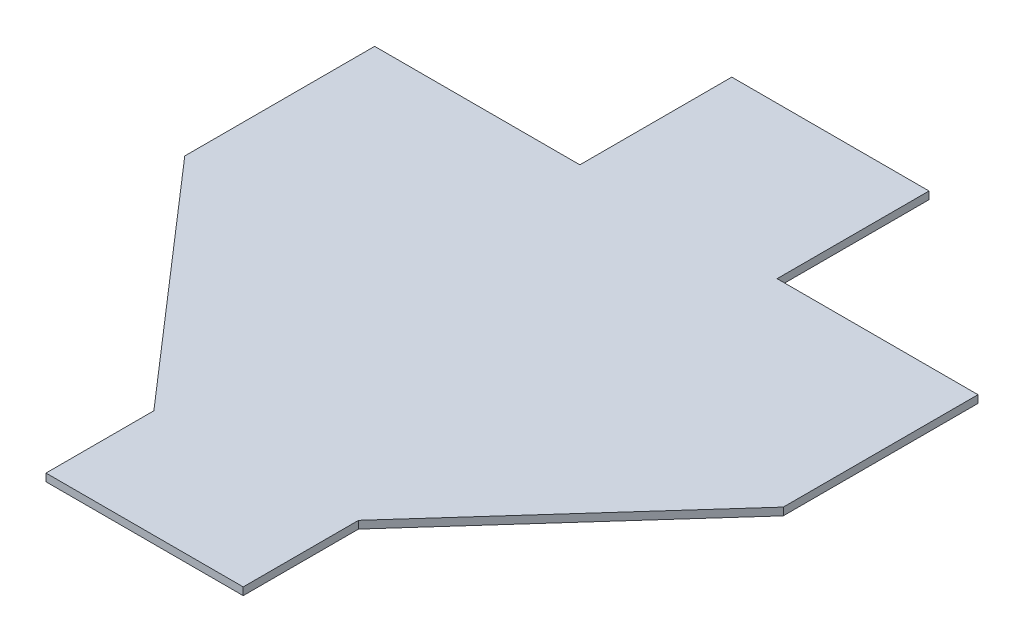
ISO-10303-21;
HEADER;
FILE_DESCRIPTION(('STEP AP214'),'2;1');
FILE_NAME('part.step','',(''),(''),'','','');
FILE_SCHEMA(('AUTOMOTIVE_DESIGN { 1 0 10303 214 1 1 1 1 }'));
ENDSEC;
DATA;
#1=APPLICATION_CONTEXT('core data for automotive mechanical design processes');
#2=APPLICATION_PROTOCOL_DEFINITION('international standard','automotive_design',2000,#1);
#3=PRODUCT_CONTEXT('',#1,'mechanical');
#4=PRODUCT('Part','Part','',(#3));
#5=PRODUCT_RELATED_PRODUCT_CATEGORY('part','',(#4));
#6=PRODUCT_DEFINITION_FORMATION('','',#4);
#7=PRODUCT_DEFINITION_CONTEXT('part definition',#1,'design');
#8=PRODUCT_DEFINITION('design','',#6,#7);
#9=PRODUCT_DEFINITION_SHAPE('','',#8);
#10=(LENGTH_UNIT() NAMED_UNIT(*) SI_UNIT(.MILLI.,.METRE.));
#11=(NAMED_UNIT(*) PLANE_ANGLE_UNIT() SI_UNIT($,.RADIAN.));
#12=(NAMED_UNIT(*) SI_UNIT($,.STERADIAN.) SOLID_ANGLE_UNIT());
#13=UNCERTAINTY_MEASURE_WITH_UNIT(LENGTH_MEASURE(1.E-05),#10,'distance_accuracy_value','');
#14=(GEOMETRIC_REPRESENTATION_CONTEXT(3) GLOBAL_UNCERTAINTY_ASSIGNED_CONTEXT((#13)) GLOBAL_UNIT_ASSIGNED_CONTEXT((#10,
#11,#12)) REPRESENTATION_CONTEXT('',''));
#15=CARTESIAN_POINT('',(0.,0.,0.));
#16=DIRECTION('',(0.,0.,1.));
#17=DIRECTION('',(1.,0.,0.));
#18=AXIS2_PLACEMENT_3D('',#15,#16,#17);
#19=CARTESIAN_POINT('',(-44.1194391139685,1.,-42.0267122818937));
#20=DIRECTION('',(0.,0.,1.));
#21=DIRECTION('',(1.,0.,0.));
#22=AXIS2_PLACEMENT_3D('',#19,#20,#21);
#23=PLANE('',#22);
#24=DIRECTION('',(-1.,0.,0.));
#25=VECTOR('',#24,1.);
#26=CARTESIAN_POINT('',(-44.1194391139685,0.,-42.0267122818937));
#27=LINE('',#26,#25);
#28=CARTESIAN_POINT('',(-17.1012495668824,0.,-42.0267122818937));
#29=VERTEX_POINT('',#28);
#30=CARTESIAN_POINT('',(-44.1194391139685,0.,-42.0267122818937));
#31=VERTEX_POINT('',#30);
#32=EDGE_CURVE('E139',#29,#31,#27,.T.);
#33=ORIENTED_EDGE('',*,*,#32,.T.);
#34=DIRECTION('',(0.,-1.,0.));
#35=VECTOR('',#34,1.);
#36=CARTESIAN_POINT('',(-44.1194391139685,1.,-42.0267122818937));
#37=LINE('',#36,#35);
#38=CARTESIAN_POINT('',(-44.1194391139685,1.,-42.0267122818937));
#39=VERTEX_POINT('',#38);
#40=EDGE_CURVE('E11',#39,#31,#37,.T.);
#41=ORIENTED_EDGE('',*,*,#40,.F.);
#42=DIRECTION('',(-1.,0.,0.));
#43=VECTOR('',#42,1.);
#44=CARTESIAN_POINT('',(-44.1194391139685,1.,-42.0267122818937));
#45=LINE('',#44,#43);
#46=CARTESIAN_POINT('',(-17.1012495668824,1.,-42.0267122818937));
#47=VERTEX_POINT('',#46);
#48=EDGE_CURVE('E158',#47,#39,#45,.T.);
#49=ORIENTED_EDGE('',*,*,#48,.F.);
#50=DIRECTION('',(0.,-1.,0.));
#51=VECTOR('',#50,1.);
#52=CARTESIAN_POINT('',(-17.1012495668824,1.,-42.0267122818937));
#53=LINE('',#52,#51);
#54=EDGE_CURVE('E135',#47,#29,#53,.T.);
#55=ORIENTED_EDGE('',*,*,#54,.T.);
#56=EDGE_LOOP('',(#33,#41,#49,#55));
#57=FACE_BOUND('',#56,.T.);
#58=ADVANCED_FACE('F33',(#57),#23,.F.);
#59=CARTESIAN_POINT('',(-44.1194391139685,1.,-42.0267122818937));
#60=DIRECTION('',(1.,0.,0.));
#61=DIRECTION('',(0.,0.,-1.));
#62=AXIS2_PLACEMENT_3D('',#59,#60,#61);
#63=PLANE('',#62);
#64=DIRECTION('',(0.,0.,1.));
#65=VECTOR('',#64,1.);
#66=CARTESIAN_POINT('',(-44.1194391139685,0.,-42.0267122818937));
#67=LINE('',#66,#65);
#68=CARTESIAN_POINT('',(-44.1194391139685,0.,-17.0267122818937));
#69=VERTEX_POINT('',#68);
#70=EDGE_CURVE('E142',#31,#69,#67,.T.);
#71=ORIENTED_EDGE('',*,*,#70,.T.);
#72=DIRECTION('',(0.,-1.,0.));
#73=VECTOR('',#72,1.);
#74=CARTESIAN_POINT('',(-44.1194391139685,1.,-17.0267122818937));
#75=LINE('',#74,#73);
#76=CARTESIAN_POINT('',(-44.1194391139685,1.,-17.0267122818937));
#77=VERTEX_POINT('',#76);
#78=EDGE_CURVE('E40',#77,#69,#75,.T.);
#79=ORIENTED_EDGE('',*,*,#78,.F.);
#80=DIRECTION('',(0.,0.,1.));
#81=VECTOR('',#80,1.);
#82=CARTESIAN_POINT('',(-44.1194391139685,1.,-42.0267122818937));
#83=LINE('',#82,#81);
#84=EDGE_CURVE('E96',#39,#77,#83,.T.);
#85=ORIENTED_EDGE('',*,*,#84,.F.);
#86=ORIENTED_EDGE('',*,*,#40,.T.);
#87=EDGE_LOOP('',(#71,#79,#85,#86));
#88=FACE_BOUND('',#87,.T.);
#89=ADVANCED_FACE('F257',(#88),#63,.F.);
#90=CARTESIAN_POINT('',(-44.1194391139685,1.,-17.0267122818937));
#91=DIRECTION('',(0.754772813640544,0.,-0.655986280183615));
#92=DIRECTION('',(-0.655986280183615,0.,-0.754772813640544));
#93=AXIS2_PLACEMENT_3D('',#90,#91,#92);
#94=PLANE('',#93);
#95=DIRECTION('',(0.655986280183615,0.,0.754772813640544));
#96=VECTOR('',#95,1.);
#97=CARTESIAN_POINT('',(-44.1194391139685,0.,-17.0267122818937));
#98=LINE('',#97,#96);
#99=CARTESIAN_POINT('',(-17.1012495668824,0.,14.0602106614028));
#100=VERTEX_POINT('',#99);
#101=EDGE_CURVE('E145',#69,#100,#98,.T.);
#102=ORIENTED_EDGE('',*,*,#101,.T.);
#103=DIRECTION('',(0.,1.,0.));
#104=VECTOR('',#103,1.);
#105=CARTESIAN_POINT('',(-17.1012495668824,1.,14.0602106614028));
#106=LINE('',#105,#104);
#107=CARTESIAN_POINT('',(-17.1012495668824,1.,14.0602106614028));
#108=VERTEX_POINT('',#107);
#109=EDGE_CURVE('E207',#100,#108,#106,.T.);
#110=ORIENTED_EDGE('',*,*,#109,.T.);
#111=DIRECTION('',(0.655986280183615,0.,0.754772813640544));
#112=VECTOR('',#111,1.);
#113=CARTESIAN_POINT('',(-44.1194391139685,1.,-17.0267122818937));
#114=LINE('',#113,#112);
#115=EDGE_CURVE('E174',#77,#108,#114,.T.);
#116=ORIENTED_EDGE('',*,*,#115,.F.);
#117=ORIENTED_EDGE('',*,*,#78,.T.);
#118=EDGE_LOOP('',(#102,#110,#116,#117));
#119=FACE_BOUND('',#118,.T.);
#120=ADVANCED_FACE('F171',(#119),#94,.F.);
#121=CARTESIAN_POINT('',(35.3138908050128,1.,-16.3952676340318));
#122=DIRECTION('',(-0.74424873617618,0.,-0.667902551799407));
#123=DIRECTION('',(-0.667902551799407,0.,0.74424873617618));
#124=AXIS2_PLACEMENT_3D('',#121,#122,#123);
#125=PLANE('',#124);
#126=DIRECTION('',(0.667902551799407,0.,-0.74424873617618));
#127=VECTOR('',#126,1.);
#128=CARTESIAN_POINT('',(35.3138908050128,1.,-16.3952676340318));
#129=LINE('',#128,#127);
#130=CARTESIAN_POINT('',(8.86237133894533,1.,13.0798554651727));
#131=VERTEX_POINT('',#130);
#132=CARTESIAN_POINT('',(35.3138908050128,1.,-16.3952676340318));
#133=VERTEX_POINT('',#132);
#134=EDGE_CURVE('E215',#131,#133,#129,.T.);
#135=ORIENTED_EDGE('',*,*,#134,.F.);
#136=DIRECTION('',(0.,-1.,0.));
#137=VECTOR('',#136,1.);
#138=CARTESIAN_POINT('',(8.86237133894533,1.,13.0798554651727));
#139=LINE('',#138,#137);
#140=CARTESIAN_POINT('',(8.86237133894533,0.,13.0798554651727));
#141=VERTEX_POINT('',#140);
#142=EDGE_CURVE('E143',#131,#141,#139,.T.);
#143=ORIENTED_EDGE('',*,*,#142,.T.);
#144=DIRECTION('',(0.667902551799407,0.,-0.74424873617618));
#145=VECTOR('',#144,1.);
#146=CARTESIAN_POINT('',(35.3138908050128,0.,-16.3952676340318));
#147=LINE('',#146,#145);
#148=CARTESIAN_POINT('',(35.3138908050128,0.,-16.3952676340318));
#149=VERTEX_POINT('',#148);
#150=EDGE_CURVE('E148',#141,#149,#147,.T.);
#151=ORIENTED_EDGE('',*,*,#150,.T.);
#152=DIRECTION('',(0.,-1.,0.));
#153=VECTOR('',#152,1.);
#154=CARTESIAN_POINT('',(35.3138908050128,1.,-16.3952676340318));
#155=LINE('',#154,#153);
#156=EDGE_CURVE('E165',#133,#149,#155,.T.);
#157=ORIENTED_EDGE('',*,*,#156,.F.);
#158=EDGE_LOOP('',(#135,#143,#151,#157));
#159=FACE_BOUND('',#158,.T.);
#160=ADVANCED_FACE('F249',(#159),#125,.F.);
#161=CARTESIAN_POINT('',(35.3138908050128,1.,-42.0267122818937));
#162=DIRECTION('',(-1.,0.,0.));
#163=DIRECTION('',(0.,0.,1.));
#164=AXIS2_PLACEMENT_3D('',#161,#162,#163);
#165=PLANE('',#164);
#166=DIRECTION('',(0.,0.,-1.));
#167=VECTOR('',#166,1.);
#168=CARTESIAN_POINT('',(35.3138908050128,0.,-42.0267122818937));
#169=LINE('',#168,#167);
#170=CARTESIAN_POINT('',(35.3138908050128,0.,-42.0267122818937));
#171=VERTEX_POINT('',#170);
#172=EDGE_CURVE('E150',#149,#171,#169,.T.);
#173=ORIENTED_EDGE('',*,*,#172,.T.);
#174=DIRECTION('',(0.,-1.,0.));
#175=VECTOR('',#174,1.);
#176=CARTESIAN_POINT('',(35.3138908050128,1.,-42.0267122818937));
#177=LINE('',#176,#175);
#178=CARTESIAN_POINT('',(35.3138908050128,1.,-42.0267122818937));
#179=VERTEX_POINT('',#178);
#180=EDGE_CURVE('E162',#179,#171,#177,.T.);
#181=ORIENTED_EDGE('',*,*,#180,.F.);
#182=DIRECTION('',(0.,0.,-1.));
#183=VECTOR('',#182,1.);
#184=CARTESIAN_POINT('',(35.3138908050128,1.,-42.0267122818937));
#185=LINE('',#184,#183);
#186=EDGE_CURVE('E217',#133,#179,#185,.T.);
#187=ORIENTED_EDGE('',*,*,#186,.F.);
#188=ORIENTED_EDGE('',*,*,#156,.T.);
#189=EDGE_LOOP('',(#173,#181,#187,#188));
#190=FACE_BOUND('',#189,.T.);
#191=ADVANCED_FACE('F223',(#190),#165,.F.);
#192=CARTESIAN_POINT('',(8.86237133894533,1.,-42.0267122818937));
#193=DIRECTION('',(0.,0.,1.));
#194=DIRECTION('',(1.,0.,0.));
#195=AXIS2_PLACEMENT_3D('',#192,#193,#194);
#196=PLANE('',#195);
#197=DIRECTION('',(-1.,0.,0.));
#198=VECTOR('',#197,1.);
#199=CARTESIAN_POINT('',(8.86237133894533,0.,-42.0267122818937));
#200=LINE('',#199,#198);
#201=CARTESIAN_POINT('',(8.86237133894533,0.,-42.0267122818937));
#202=VERTEX_POINT('',#201);
#203=EDGE_CURVE('E152',#171,#202,#200,.T.);
#204=ORIENTED_EDGE('',*,*,#203,.T.);
#205=DIRECTION('',(0.,-1.,0.));
#206=VECTOR('',#205,1.);
#207=CARTESIAN_POINT('',(8.86237133894533,1.,-42.0267122818937));
#208=LINE('',#207,#206);
#209=CARTESIAN_POINT('',(8.86237133894533,1.,-42.0267122818937));
#210=VERTEX_POINT('',#209);
#211=EDGE_CURVE('E130',#210,#202,#208,.T.);
#212=ORIENTED_EDGE('',*,*,#211,.F.);
#213=DIRECTION('',(-1.,0.,0.));
#214=VECTOR('',#213,1.);
#215=CARTESIAN_POINT('',(8.86237133894533,1.,-42.0267122818937));
#216=LINE('',#215,#214);
#217=EDGE_CURVE('E118',#179,#210,#216,.T.);
#218=ORIENTED_EDGE('',*,*,#217,.F.);
#219=ORIENTED_EDGE('',*,*,#180,.T.);
#220=EDGE_LOOP('',(#204,#212,#218,#219));
#221=FACE_BOUND('',#220,.T.);
#222=ADVANCED_FACE('F227',(#221),#196,.F.);
#223=CARTESIAN_POINT('',(8.86237133894533,1.,-62.0267122818937));
#224=DIRECTION('',(-1.,0.,0.));
#225=DIRECTION('',(0.,0.,1.));
#226=AXIS2_PLACEMENT_3D('',#223,#224,#225);
#227=PLANE('',#226);
#228=DIRECTION('',(0.,0.,-1.));
#229=VECTOR('',#228,1.);
#230=CARTESIAN_POINT('',(8.86237133894533,0.,-62.0267122818937));
#231=LINE('',#230,#229);
#232=CARTESIAN_POINT('',(8.86237133894533,0.,-62.0267122818937));
#233=VERTEX_POINT('',#232);
#234=EDGE_CURVE('E127',#202,#233,#231,.T.);
#235=ORIENTED_EDGE('',*,*,#234,.T.);
#236=DIRECTION('',(0.,-1.,0.));
#237=VECTOR('',#236,1.);
#238=CARTESIAN_POINT('',(8.86237133894533,1.,-62.0267122818937));
#239=LINE('',#238,#237);
#240=CARTESIAN_POINT('',(8.86237133894533,1.,-62.0267122818937));
#241=VERTEX_POINT('',#240);
#242=EDGE_CURVE('E124',#241,#233,#239,.T.);
#243=ORIENTED_EDGE('',*,*,#242,.F.);
#244=DIRECTION('',(0.,0.,-1.));
#245=VECTOR('',#244,1.);
#246=CARTESIAN_POINT('',(8.86237133894533,1.,-62.0267122818937));
#247=LINE('',#246,#245);
#248=EDGE_CURVE('E110',#210,#241,#247,.T.);
#249=ORIENTED_EDGE('',*,*,#248,.F.);
#250=ORIENTED_EDGE('',*,*,#211,.T.);
#251=EDGE_LOOP('',(#235,#243,#249,#250));
#252=FACE_BOUND('',#251,.T.);
#253=ADVANCED_FACE('F125',(#252),#227,.F.);
#254=CARTESIAN_POINT('',(8.86237133894533,1.,-62.0267122818937));
#255=DIRECTION('',(0.,0.,1.));
#256=DIRECTION('',(1.,0.,0.));
#257=AXIS2_PLACEMENT_3D('',#254,#255,#256);
#258=PLANE('',#257);
#259=DIRECTION('',(-1.,0.,0.));
#260=VECTOR('',#259,1.);
#261=CARTESIAN_POINT('',(8.86237133894533,0.,-62.0267122818937));
#262=LINE('',#261,#260);
#263=CARTESIAN_POINT('',(-17.1012495668824,0.,-62.0267122818937));
#264=VERTEX_POINT('',#263);
#265=EDGE_CURVE('E155',#233,#264,#262,.T.);
#266=ORIENTED_EDGE('',*,*,#265,.T.);
#267=DIRECTION('',(0.,-1.,0.));
#268=VECTOR('',#267,1.);
#269=CARTESIAN_POINT('',(-17.1012495668824,1.,-62.0267122818937));
#270=LINE('',#269,#268);
#271=CARTESIAN_POINT('',(-17.1012495668824,1.,-62.0267122818937));
#272=VERTEX_POINT('',#271);
#273=EDGE_CURVE('E131',#272,#264,#270,.T.);
#274=ORIENTED_EDGE('',*,*,#273,.F.);
#275=DIRECTION('',(-1.,0.,0.));
#276=VECTOR('',#275,1.);
#277=CARTESIAN_POINT('',(8.86237133894533,1.,-62.0267122818937));
#278=LINE('',#277,#276);
#279=EDGE_CURVE('E115',#241,#272,#278,.T.);
#280=ORIENTED_EDGE('',*,*,#279,.F.);
#281=ORIENTED_EDGE('',*,*,#242,.T.);
#282=EDGE_LOOP('',(#266,#274,#280,#281));
#283=FACE_BOUND('',#282,.T.);
#284=ADVANCED_FACE('F133',(#283),#258,.F.);
#285=CARTESIAN_POINT('',(-17.1012495668824,1.,-62.0267122818937));
#286=DIRECTION('',(1.,0.,0.));
#287=DIRECTION('',(0.,0.,-1.));
#288=AXIS2_PLACEMENT_3D('',#285,#286,#287);
#289=PLANE('',#288);
#290=DIRECTION('',(0.,0.,1.));
#291=VECTOR('',#290,1.);
#292=CARTESIAN_POINT('',(-17.1012495668824,0.,-62.0267122818937));
#293=LINE('',#292,#291);
#294=EDGE_CURVE('E88',#264,#29,#293,.T.);
#295=ORIENTED_EDGE('',*,*,#294,.T.);
#296=ORIENTED_EDGE('',*,*,#54,.F.);
#297=DIRECTION('',(0.,0.,1.));
#298=VECTOR('',#297,1.);
#299=CARTESIAN_POINT('',(-17.1012495668824,1.,-62.0267122818937));
#300=LINE('',#299,#298);
#301=EDGE_CURVE('E55',#272,#47,#300,.T.);
#302=ORIENTED_EDGE('',*,*,#301,.F.);
#303=ORIENTED_EDGE('',*,*,#273,.T.);
#304=EDGE_LOOP('',(#295,#296,#302,#303));
#305=FACE_BOUND('',#304,.T.);
#306=ADVANCED_FACE('F228',(#305),#289,.F.);
#307=CARTESIAN_POINT('',(0.,1.,0.));
#308=DIRECTION('',(0.,-1.,0.));
#309=DIRECTION('',(0.,0.,-1.));
#310=AXIS2_PLACEMENT_3D('',#307,#308,#309);
#311=PLANE('',#310);
#312=ORIENTED_EDGE('',*,*,#115,.T.);
#313=DIRECTION('',(0.,0.,1.));
#314=VECTOR('',#313,1.);
#315=CARTESIAN_POINT('',(-17.1012495668824,1.,-42.0267122818937));
#316=LINE('',#315,#314);
#317=CARTESIAN_POINT('',(-17.1012495668824,1.,28.259656536539));
#318=VERTEX_POINT('',#317);
#319=EDGE_CURVE('E200',#108,#318,#316,.T.);
#320=ORIENTED_EDGE('',*,*,#319,.T.);
#321=DIRECTION('',(1.,0.,0.));
#322=VECTOR('',#321,1.);
#323=CARTESIAN_POINT('',(8.86237133894533,1.,28.259656536539));
#324=LINE('',#323,#322);
#325=CARTESIAN_POINT('',(8.86237133894533,1.,28.259656536539));
#326=VERTEX_POINT('',#325);
#327=EDGE_CURVE('E194',#318,#326,#324,.T.);
#328=ORIENTED_EDGE('',*,*,#327,.T.);
#329=DIRECTION('',(0.,0.,-1.));
#330=VECTOR('',#329,1.);
#331=CARTESIAN_POINT('',(8.86237133894533,1.,-62.0267122818937));
#332=LINE('',#331,#330);
#333=EDGE_CURVE('E47',#326,#131,#332,.T.);
#334=ORIENTED_EDGE('',*,*,#333,.T.);
#335=ORIENTED_EDGE('',*,*,#134,.T.);
#336=ORIENTED_EDGE('',*,*,#186,.T.);
#337=ORIENTED_EDGE('',*,*,#217,.T.);
#338=ORIENTED_EDGE('',*,*,#248,.T.);
#339=ORIENTED_EDGE('',*,*,#279,.T.);
#340=ORIENTED_EDGE('',*,*,#301,.T.);
#341=ORIENTED_EDGE('',*,*,#48,.T.);
#342=ORIENTED_EDGE('',*,*,#84,.T.);
#343=EDGE_LOOP('',(#312,#320,#328,#334,#335,#336,#337,#338,#339,#340,#341,#342));
#344=FACE_BOUND('',#343,.T.);
#345=ADVANCED_FACE('F113',(#344),#311,.F.);
#346=CARTESIAN_POINT('',(0.,0.,0.));
#347=DIRECTION('',(0.,-1.,0.));
#348=DIRECTION('',(0.,0.,-1.));
#349=AXIS2_PLACEMENT_3D('',#346,#347,#348);
#350=PLANE('',#349);
#351=ORIENTED_EDGE('',*,*,#32,.F.);
#352=ORIENTED_EDGE('',*,*,#294,.F.);
#353=ORIENTED_EDGE('',*,*,#265,.F.);
#354=ORIENTED_EDGE('',*,*,#234,.F.);
#355=ORIENTED_EDGE('',*,*,#203,.F.);
#356=ORIENTED_EDGE('',*,*,#172,.F.);
#357=ORIENTED_EDGE('',*,*,#150,.F.);
#358=DIRECTION('',(0.,0.,-1.));
#359=VECTOR('',#358,1.);
#360=CARTESIAN_POINT('',(8.86237133894533,0.,-62.0267122818937));
#361=LINE('',#360,#359);
#362=CARTESIAN_POINT('',(8.86237133894533,0.,28.259656536539));
#363=VERTEX_POINT('',#362);
#364=EDGE_CURVE('E192',#363,#141,#361,.T.);
#365=ORIENTED_EDGE('',*,*,#364,.F.);
#366=DIRECTION('',(1.,0.,0.));
#367=VECTOR('',#366,1.);
#368=CARTESIAN_POINT('',(8.86237133894533,0.,28.259656536539));
#369=LINE('',#368,#367);
#370=CARTESIAN_POINT('',(-17.1012495668824,0.,28.259656536539));
#371=VERTEX_POINT('',#370);
#372=EDGE_CURVE('E185',#371,#363,#369,.T.);
#373=ORIENTED_EDGE('',*,*,#372,.F.);
#374=DIRECTION('',(0.,0.,1.));
#375=VECTOR('',#374,1.);
#376=CARTESIAN_POINT('',(-17.1012495668824,0.,-42.0267122818937));
#377=LINE('',#376,#375);
#378=EDGE_CURVE('E181',#100,#371,#377,.T.);
#379=ORIENTED_EDGE('',*,*,#378,.F.);
#380=ORIENTED_EDGE('',*,*,#101,.F.);
#381=ORIENTED_EDGE('',*,*,#70,.F.);
#382=EDGE_LOOP('',(#351,#352,#353,#354,#355,#356,#357,#365,#373,#379,#380,#381));
#383=FACE_BOUND('',#382,.T.);
#384=ADVANCED_FACE('F178',(#383),#350,.T.);
#385=CARTESIAN_POINT('',(8.86237133894533,0.,-62.0267122818937));
#386=DIRECTION('',(1.,0.,0.));
#387=DIRECTION('',(0.,0.,-1.));
#388=AXIS2_PLACEMENT_3D('',#385,#386,#387);
#389=PLANE('',#388);
#390=ORIENTED_EDGE('',*,*,#142,.F.);
#391=ORIENTED_EDGE('',*,*,#333,.F.);
#392=DIRECTION('',(0.,1.,0.));
#393=VECTOR('',#392,1.);
#394=CARTESIAN_POINT('',(8.86237133894533,0.,28.259656536539));
#395=LINE('',#394,#393);
#396=EDGE_CURVE('E204',#363,#326,#395,.T.);
#397=ORIENTED_EDGE('',*,*,#396,.F.);
#398=ORIENTED_EDGE('',*,*,#364,.T.);
#399=EDGE_LOOP('',(#390,#391,#397,#398));
#400=FACE_BOUND('',#399,.T.);
#401=ADVANCED_FACE('F246',(#400),#389,.T.);
#402=CARTESIAN_POINT('',(8.86237133894533,0.,28.259656536539));
#403=DIRECTION('',(0.,0.,1.));
#404=DIRECTION('',(1.,0.,0.));
#405=AXIS2_PLACEMENT_3D('',#402,#403,#404);
#406=PLANE('',#405);
#407=ORIENTED_EDGE('',*,*,#396,.T.);
#408=ORIENTED_EDGE('',*,*,#327,.F.);
#409=DIRECTION('',(0.,1.,0.));
#410=VECTOR('',#409,1.);
#411=CARTESIAN_POINT('',(-17.1012495668824,0.,28.259656536539));
#412=LINE('',#411,#410);
#413=EDGE_CURVE('E199',#371,#318,#412,.T.);
#414=ORIENTED_EDGE('',*,*,#413,.F.);
#415=ORIENTED_EDGE('',*,*,#372,.T.);
#416=EDGE_LOOP('',(#407,#408,#414,#415));
#417=FACE_BOUND('',#416,.T.);
#418=ADVANCED_FACE('F244',(#417),#406,.T.);
#419=CARTESIAN_POINT('',(-17.1012495668824,0.,-42.0267122818937));
#420=DIRECTION('',(-1.,0.,0.));
#421=DIRECTION('',(0.,0.,1.));
#422=AXIS2_PLACEMENT_3D('',#419,#420,#421);
#423=PLANE('',#422);
#424=ORIENTED_EDGE('',*,*,#109,.F.);
#425=ORIENTED_EDGE('',*,*,#378,.T.);
#426=ORIENTED_EDGE('',*,*,#413,.T.);
#427=ORIENTED_EDGE('',*,*,#319,.F.);
#428=EDGE_LOOP('',(#424,#425,#426,#427));
#429=FACE_BOUND('',#428,.T.);
#430=ADVANCED_FACE('F315',(#429),#423,.T.);
#431=CLOSED_SHELL('',(#58,#89,#120,#160,#191,#222,#253,#284,#306,#345,#384,#401,#418,#430));
#432=MANIFOLD_SOLID_BREP('B2',#431);
#433=ADVANCED_BREP_SHAPE_REPRESENTATION('',(#18,#432),#14);
#434=SHAPE_DEFINITION_REPRESENTATION(#9,#433);
ENDSEC;
END-ISO-10303-21;
